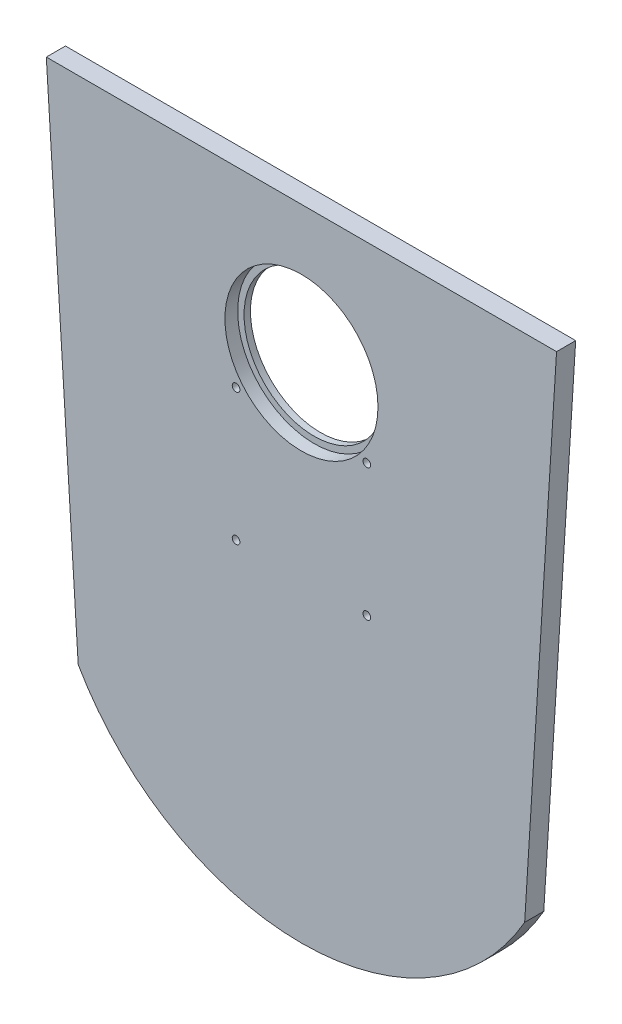
ISO-10303-21;
HEADER;
FILE_DESCRIPTION(('STEP AP214'),'2;1');
FILE_NAME('part.step','',(''),(''),'','','');
FILE_SCHEMA(('AUTOMOTIVE_DESIGN { 1 0 10303 214 1 1 1 1 }'));
ENDSEC;
DATA;
#1=APPLICATION_CONTEXT('core data for automotive mechanical design processes');
#2=APPLICATION_PROTOCOL_DEFINITION('international standard','automotive_design',2000,#1);
#3=PRODUCT_CONTEXT('',#1,'mechanical');
#4=PRODUCT('Part','Part','',(#3));
#5=PRODUCT_RELATED_PRODUCT_CATEGORY('part','',(#4));
#6=PRODUCT_DEFINITION_FORMATION('','',#4);
#7=PRODUCT_DEFINITION_CONTEXT('part definition',#1,'design');
#8=PRODUCT_DEFINITION('design','',#6,#7);
#9=PRODUCT_DEFINITION_SHAPE('','',#8);
#10=(LENGTH_UNIT() NAMED_UNIT(*) SI_UNIT(.MILLI.,.METRE.));
#11=(NAMED_UNIT(*) PLANE_ANGLE_UNIT() SI_UNIT($,.RADIAN.));
#12=(NAMED_UNIT(*) SI_UNIT($,.STERADIAN.) SOLID_ANGLE_UNIT());
#13=UNCERTAINTY_MEASURE_WITH_UNIT(LENGTH_MEASURE(1.E-05),#10,'distance_accuracy_value','');
#14=(GEOMETRIC_REPRESENTATION_CONTEXT(3) GLOBAL_UNCERTAINTY_ASSIGNED_CONTEXT((#13)) GLOBAL_UNIT_ASSIGNED_CONTEXT((#10,
#11,#12)) REPRESENTATION_CONTEXT('',''));
#15=CARTESIAN_POINT('',(0.,0.,0.));
#16=DIRECTION('',(0.,0.,1.));
#17=DIRECTION('',(1.,0.,0.));
#18=AXIS2_PLACEMENT_3D('',#15,#16,#17);
#19=CARTESIAN_POINT('',(35.,58.5,-0.00100000000000013));
#20=DIRECTION('',(0.,0.,1.));
#21=DIRECTION('',(1.,0.,0.));
#22=AXIS2_PLACEMENT_3D('',#19,#20,#21);
#23=CYLINDRICAL_SURFACE('',#22,11.);
#24=CARTESIAN_POINT('',(35.,58.5,0.));
#25=DIRECTION('',(0.,0.,-1.));
#26=DIRECTION('',(-1.,0.,0.));
#27=AXIS2_PLACEMENT_3D('',#24,#25,#26);
#28=CIRCLE('',#27,11.);
#29=CARTESIAN_POINT('',(46.,58.5,0.));
#30=VERTEX_POINT('',#29);
#31=EDGE_CURVE('E121',#30,#30,#28,.F.);
#32=CARTESIAN_POINT('',(35.,58.5,1.));
#33=DIRECTION('',(0.,0.,1.));
#34=DIRECTION('',(1.,0.,0.));
#35=AXIS2_PLACEMENT_3D('',#32,#33,#34);
#36=CIRCLE('',#35,11.);
#37=CARTESIAN_POINT('',(46.,58.5,1.));
#38=VERTEX_POINT('',#37);
#39=EDGE_CURVE('E41',#38,#38,#36,.F.);
#40=CARTESIAN_POINT('',(46.,58.5,0.));
#41=CARTESIAN_POINT('',(46.,58.5,0.0104166666666667));
#42=CARTESIAN_POINT('',(46.,58.5,0.0208333333333333));
#43=CARTESIAN_POINT('',(46.,58.5,0.0416666666666667));
#44=CARTESIAN_POINT('',(46.,58.5,0.0520833333333333));
#45=CARTESIAN_POINT('',(46.,58.5,0.0729166666666667));
#46=CARTESIAN_POINT('',(46.,58.5,0.0833333333333333));
#47=CARTESIAN_POINT('',(46.,58.5,0.104166666666667));
#48=CARTESIAN_POINT('',(46.,58.5,0.114583333333333));
#49=CARTESIAN_POINT('',(46.,58.5,0.135416666666667));
#50=CARTESIAN_POINT('',(46.,58.5,0.145833333333333));
#51=CARTESIAN_POINT('',(46.,58.5,0.166666666666667));
#52=CARTESIAN_POINT('',(46.,58.5,0.177083333333333));
#53=CARTESIAN_POINT('',(46.,58.5,0.197916666666667));
#54=CARTESIAN_POINT('',(46.,58.5,0.208333333333333));
#55=CARTESIAN_POINT('',(46.,58.5,0.229166666666667));
#56=CARTESIAN_POINT('',(46.,58.5,0.239583333333333));
#57=CARTESIAN_POINT('',(46.,58.5,0.260416666666667));
#58=CARTESIAN_POINT('',(46.,58.5,0.270833333333333));
#59=CARTESIAN_POINT('',(46.,58.5,0.291666666666667));
#60=CARTESIAN_POINT('',(46.,58.5,0.302083333333333));
#61=CARTESIAN_POINT('',(46.,58.5,0.322916666666667));
#62=CARTESIAN_POINT('',(46.,58.5,0.333333333333333));
#63=CARTESIAN_POINT('',(46.,58.5,0.354166666666667));
#64=CARTESIAN_POINT('',(46.,58.5,0.364583333333333));
#65=CARTESIAN_POINT('',(46.,58.5,0.385416666666667));
#66=CARTESIAN_POINT('',(46.,58.5,0.395833333333333));
#67=CARTESIAN_POINT('',(46.,58.5,0.416666666666667));
#68=CARTESIAN_POINT('',(46.,58.5,0.427083333333333));
#69=CARTESIAN_POINT('',(46.,58.5,0.447916666666667));
#70=CARTESIAN_POINT('',(46.,58.5,0.458333333333333));
#71=CARTESIAN_POINT('',(46.,58.5,0.479166666666667));
#72=CARTESIAN_POINT('',(46.,58.5,0.489583333333333));
#73=CARTESIAN_POINT('',(46.,58.5,0.510416666666667));
#74=CARTESIAN_POINT('',(46.,58.5,0.520833333333333));
#75=CARTESIAN_POINT('',(46.,58.5,0.541666666666667));
#76=CARTESIAN_POINT('',(46.,58.5,0.552083333333333));
#77=CARTESIAN_POINT('',(46.,58.5,0.572916666666667));
#78=CARTESIAN_POINT('',(46.,58.5,0.583333333333333));
#79=CARTESIAN_POINT('',(46.,58.5,0.604166666666667));
#80=CARTESIAN_POINT('',(46.,58.5,0.614583333333333));
#81=CARTESIAN_POINT('',(46.,58.5,0.635416666666667));
#82=CARTESIAN_POINT('',(46.,58.5,0.645833333333333));
#83=CARTESIAN_POINT('',(46.,58.5,0.666666666666667));
#84=CARTESIAN_POINT('',(46.,58.5,0.677083333333333));
#85=CARTESIAN_POINT('',(46.,58.5,0.697916666666667));
#86=CARTESIAN_POINT('',(46.,58.5,0.708333333333333));
#87=CARTESIAN_POINT('',(46.,58.5,0.729166666666667));
#88=CARTESIAN_POINT('',(46.,58.5,0.739583333333333));
#89=CARTESIAN_POINT('',(46.,58.5,0.760416666666667));
#90=CARTESIAN_POINT('',(46.,58.5,0.770833333333333));
#91=CARTESIAN_POINT('',(46.,58.5,0.791666666666667));
#92=CARTESIAN_POINT('',(46.,58.5,0.802083333333333));
#93=CARTESIAN_POINT('',(46.,58.5,0.822916666666667));
#94=CARTESIAN_POINT('',(46.,58.5,0.833333333333333));
#95=CARTESIAN_POINT('',(46.,58.5,0.854166666666667));
#96=CARTESIAN_POINT('',(46.,58.5,0.864583333333333));
#97=CARTESIAN_POINT('',(46.,58.5,0.885416666666667));
#98=CARTESIAN_POINT('',(46.,58.5,0.895833333333333));
#99=CARTESIAN_POINT('',(46.,58.5,0.916666666666667));
#100=CARTESIAN_POINT('',(46.,58.5,0.927083333333333));
#101=CARTESIAN_POINT('',(46.,58.5,0.947916666666667));
#102=CARTESIAN_POINT('',(46.,58.5,0.958333333333333));
#103=CARTESIAN_POINT('',(46.,58.5,0.979166666666667));
#104=CARTESIAN_POINT('',(46.,58.5,0.989583333333333));
#105=CARTESIAN_POINT('',(46.,58.5,1.));
#106=B_SPLINE_CURVE_WITH_KNOTS('',3,(#40,#41,#42,#43,#44,#45,#46,#47,#48,#49,#50,#51,#52,#53,
#54,#55,#56,#57,#58,#59,#60,#61,#62,#63,#64,#65,#66,#67,#68,#69,#70,#71,#72,#73,#74,#75,#76,#77,
#78,#79,#80,#81,#82,#83,#84,#85,#86,#87,#88,#89,#90,#91,#92,#93,#94,#95,#96,#97,#98,#99,#100,
#101,#102,#103,#104,#105),.UNSPECIFIED.,.F.,.F.,(4,2,2,2,2,2,2,2,2,2,2,2,2,2,2,2,2,2,2,2,2,2,2,
2,2,2,2,2,2,2,2,2,4),(0.,0.03125,0.0625,0.09375,0.125,0.15625,0.1875,0.21875,0.25,0.28125,
0.3125,0.34375,0.375,0.40625,0.4375,0.46875,0.5,0.53125,0.5625,0.59375,0.625,0.65625,0.6875,
0.71875,0.75,0.78125,0.8125,0.84375,0.875,0.90625,0.9375,0.96875,1.),.UNSPECIFIED.);
#107=EDGE_CURVE('BSEAM37',#30,#38,#106,.T.);
#108=ORIENTED_EDGE('',*,*,#31,.F.);
#109=ORIENTED_EDGE('',*,*,#39,.F.);
#110=ORIENTED_EDGE('',*,*,#107,.T.);
#111=ORIENTED_EDGE('',*,*,#107,.F.);
#112=EDGE_LOOP('',(#108,#110,#109,#111));
#113=FACE_BOUND('',#112,.T.);
#114=ADVANCED_FACE('F37',(#113),#23,.F.);
#115=CARTESIAN_POINT('',(0.,80.,3.));
#116=DIRECTION('',(0.,-1.,0.));
#117=DIRECTION('',(0.,0.,-1.));
#118=AXIS2_PLACEMENT_3D('',#115,#116,#117);
#119=PLANE('',#118);
#120=DIRECTION('',(-1.,0.,0.));
#121=VECTOR('',#120,1.);
#122=CARTESIAN_POINT('',(0.,80.,0.));
#123=LINE('',#122,#121);
#124=CARTESIAN_POINT('',(75.,80.,0.));
#125=VERTEX_POINT('',#124);
#126=CARTESIAN_POINT('',(-4.99999999999999,80.,0.));
#127=VERTEX_POINT('',#126);
#128=EDGE_CURVE('E139',#125,#127,#123,.T.);
#129=ORIENTED_EDGE('',*,*,#128,.T.);
#130=DIRECTION('',(0.,0.,-1.));
#131=VECTOR('',#130,1.);
#132=CARTESIAN_POINT('',(-4.99999999999999,80.,83.156097709407));
#133=LINE('',#132,#131);
#134=CARTESIAN_POINT('',(-4.99999999999999,80.,3.));
#135=VERTEX_POINT('',#134);
#136=EDGE_CURVE('E84',#135,#127,#133,.T.);
#137=ORIENTED_EDGE('',*,*,#136,.F.);
#138=DIRECTION('',(-1.,0.,0.));
#139=VECTOR('',#138,1.);
#140=CARTESIAN_POINT('',(0.,80.,3.));
#141=LINE('',#140,#139);
#142=CARTESIAN_POINT('',(75.,80.,3.));
#143=VERTEX_POINT('',#142);
#144=EDGE_CURVE('E142',#143,#135,#141,.T.);
#145=ORIENTED_EDGE('',*,*,#144,.F.);
#146=DIRECTION('',(0.,0.,-1.));
#147=VECTOR('',#146,1.);
#148=CARTESIAN_POINT('',(75.,80.,83.156097709407));
#149=LINE('',#148,#147);
#150=EDGE_CURVE('E104',#143,#125,#149,.T.);
#151=ORIENTED_EDGE('',*,*,#150,.T.);
#152=EDGE_LOOP('',(#129,#137,#145,#151));
#153=FACE_BOUND('',#152,.T.);
#154=ADVANCED_FACE('F39',(#153),#119,.F.);
#155=CARTESIAN_POINT('',(0.,0.,3.));
#156=DIRECTION('',(0.,0.,-1.));
#157=DIRECTION('',(-1.,0.,0.));
#158=AXIS2_PLACEMENT_3D('',#155,#156,#157);
#159=PLANE('',#158);
#160=CARTESIAN_POINT('',(35.,58.5,3.));
#161=DIRECTION('',(0.,0.,1.));
#162=DIRECTION('',(1.,0.,0.));
#163=AXIS2_PLACEMENT_3D('',#160,#161,#162);
#164=CIRCLE('',#163,12.);
#165=CARTESIAN_POINT('',(47.,58.5,3.));
#166=VERTEX_POINT('',#165);
#167=EDGE_CURVE('E108',#166,#166,#164,.T.);
#168=ORIENTED_EDGE('',*,*,#167,.F.);
#169=EDGE_LOOP('',(#168));
#170=FACE_BOUND('',#169,.T.);
#171=CARTESIAN_POINT('',(45.25,50.,3.));
#172=DIRECTION('',(0.,0.,1.));
#173=DIRECTION('',(1.,0.,0.));
#174=AXIS2_PLACEMENT_3D('',#171,#172,#173);
#175=CIRCLE('',#174,0.600000000000001);
#176=CARTESIAN_POINT('',(45.85,50.,3.));
#177=VERTEX_POINT('',#176);
#178=EDGE_CURVE('E124',#177,#177,#175,.T.);
#179=ORIENTED_EDGE('',*,*,#178,.F.);
#180=EDGE_LOOP('',(#179));
#181=FACE_BOUND('',#180,.T.);
#182=CARTESIAN_POINT('',(45.25,29.3,3.));
#183=DIRECTION('',(0.,0.,1.));
#184=DIRECTION('',(1.,0.,0.));
#185=AXIS2_PLACEMENT_3D('',#182,#183,#184);
#186=CIRCLE('',#185,0.6);
#187=CARTESIAN_POINT('',(45.85,29.3,3.));
#188=VERTEX_POINT('',#187);
#189=EDGE_CURVE('E131',#188,#188,#186,.T.);
#190=ORIENTED_EDGE('',*,*,#189,.F.);
#191=EDGE_LOOP('',(#190));
#192=FACE_BOUND('',#191,.T.);
#193=CARTESIAN_POINT('',(24.75,29.3,3.));
#194=DIRECTION('',(0.,0.,1.));
#195=DIRECTION('',(1.,0.,0.));
#196=AXIS2_PLACEMENT_3D('',#193,#194,#195);
#197=CIRCLE('',#196,0.600000000000003);
#198=CARTESIAN_POINT('',(25.35,29.3,3.));
#199=VERTEX_POINT('',#198);
#200=EDGE_CURVE('E114',#199,#199,#197,.T.);
#201=ORIENTED_EDGE('',*,*,#200,.F.);
#202=EDGE_LOOP('',(#201));
#203=FACE_BOUND('',#202,.T.);
#204=CARTESIAN_POINT('',(24.75,50.,3.));
#205=DIRECTION('',(0.,0.,1.));
#206=DIRECTION('',(1.,0.,0.));
#207=AXIS2_PLACEMENT_3D('',#204,#205,#206);
#208=CIRCLE('',#207,0.600000000000005);
#209=CARTESIAN_POINT('',(25.35,50.,3.));
#210=VERTEX_POINT('',#209);
#211=EDGE_CURVE('E136',#210,#210,#208,.T.);
#212=ORIENTED_EDGE('',*,*,#211,.F.);
#213=EDGE_LOOP('',(#212));
#214=FACE_BOUND('',#213,.T.);
#215=ORIENTED_EDGE('',*,*,#144,.T.);
#216=DIRECTION('',(0.0623782861551804,-0.998052578482889,0.));
#217=VECTOR('',#216,1.);
#218=CARTESIAN_POINT('',(0.,0.,3.));
#219=LINE('',#218,#217);
#220=CARTESIAN_POINT('',(0.,0.,3.));
#221=VERTEX_POINT('',#220);
#222=EDGE_CURVE('E60',#135,#221,#219,.T.);
#223=ORIENTED_EDGE('',*,*,#222,.T.);
#224=CARTESIAN_POINT('',(35.,20.,3.));
#225=DIRECTION('',(0.,0.,-1.));
#226=DIRECTION('',(-1.,0.,0.));
#227=AXIS2_PLACEMENT_3D('',#224,#225,#226);
#228=CIRCLE('',#227,40.3112887414928);
#229=CARTESIAN_POINT('',(70.,0.,3.));
#230=VERTEX_POINT('',#229);
#231=EDGE_CURVE('E87',#221,#230,#228,.F.);
#232=ORIENTED_EDGE('',*,*,#231,.T.);
#233=DIRECTION('',(-0.0623782861551806,-0.998052578482889,0.));
#234=VECTOR('',#233,1.);
#235=CARTESIAN_POINT('',(69.727626459144,-4.3579766536965,3.));
#236=LINE('',#235,#234);
#237=EDGE_CURVE('E53',#143,#230,#236,.T.);
#238=ORIENTED_EDGE('',*,*,#237,.F.);
#239=EDGE_LOOP('',(#215,#223,#232,#238));
#240=FACE_BOUND('',#239,.T.);
#241=ADVANCED_FACE('F147',(#170,#181,#192,#203,#214,#240),#159,.F.);
#242=CARTESIAN_POINT('',(0.,0.,0.));
#243=DIRECTION('',(0.,0.,-1.));
#244=DIRECTION('',(-1.,0.,0.));
#245=AXIS2_PLACEMENT_3D('',#242,#243,#244);
#246=PLANE('',#245);
#247=CARTESIAN_POINT('',(45.25,50.,0.));
#248=DIRECTION('',(0.,0.,-1.));
#249=DIRECTION('',(-1.,0.,0.));
#250=AXIS2_PLACEMENT_3D('',#247,#248,#249);
#251=CIRCLE('',#250,0.600000000000001);
#252=CARTESIAN_POINT('',(44.65,50.,0.));
#253=VERTEX_POINT('',#252);
#254=EDGE_CURVE('E128',#253,#253,#251,.F.);
#255=ORIENTED_EDGE('',*,*,#254,.T.);
#256=EDGE_LOOP('',(#255));
#257=FACE_BOUND('',#256,.T.);
#258=CARTESIAN_POINT('',(45.25,29.3,0.));
#259=DIRECTION('',(0.,0.,-1.));
#260=DIRECTION('',(-1.,0.,0.));
#261=AXIS2_PLACEMENT_3D('',#258,#259,#260);
#262=CIRCLE('',#261,0.6);
#263=CARTESIAN_POINT('',(44.65,29.3,0.));
#264=VERTEX_POINT('',#263);
#265=EDGE_CURVE('E117',#264,#264,#262,.F.);
#266=ORIENTED_EDGE('',*,*,#265,.T.);
#267=EDGE_LOOP('',(#266));
#268=FACE_BOUND('',#267,.T.);
#269=CARTESIAN_POINT('',(24.75,29.3,0.));
#270=DIRECTION('',(0.,0.,-1.));
#271=DIRECTION('',(-1.,0.,0.));
#272=AXIS2_PLACEMENT_3D('',#269,#270,#271);
#273=CIRCLE('',#272,0.600000000000003);
#274=CARTESIAN_POINT('',(24.15,29.3,0.));
#275=VERTEX_POINT('',#274);
#276=EDGE_CURVE('E118',#275,#275,#273,.F.);
#277=ORIENTED_EDGE('',*,*,#276,.T.);
#278=EDGE_LOOP('',(#277));
#279=FACE_BOUND('',#278,.T.);
#280=ORIENTED_EDGE('',*,*,#31,.T.);
#281=EDGE_LOOP('',(#280));
#282=FACE_BOUND('',#281,.T.);
#283=CARTESIAN_POINT('',(24.75,50.,0.));
#284=DIRECTION('',(0.,0.,-1.));
#285=DIRECTION('',(-1.,0.,0.));
#286=AXIS2_PLACEMENT_3D('',#283,#284,#285);
#287=CIRCLE('',#286,0.600000000000005);
#288=CARTESIAN_POINT('',(24.15,50.,0.));
#289=VERTEX_POINT('',#288);
#290=EDGE_CURVE('E127',#289,#289,#287,.F.);
#291=ORIENTED_EDGE('',*,*,#290,.T.);
#292=EDGE_LOOP('',(#291));
#293=FACE_BOUND('',#292,.T.);
#294=DIRECTION('',(0.0623782861551806,0.998052578482889,0.));
#295=VECTOR('',#294,1.);
#296=CARTESIAN_POINT('',(69.727626459144,-4.3579766536965,0.));
#297=LINE('',#296,#295);
#298=CARTESIAN_POINT('',(70.,0.,0.));
#299=VERTEX_POINT('',#298);
#300=EDGE_CURVE('E97',#299,#125,#297,.T.);
#301=ORIENTED_EDGE('',*,*,#300,.F.);
#302=CARTESIAN_POINT('',(35.,20.,0.));
#303=DIRECTION('',(0.,0.,-1.));
#304=DIRECTION('',(-1.,0.,0.));
#305=AXIS2_PLACEMENT_3D('',#302,#303,#304);
#306=CIRCLE('',#305,40.3112887414928);
#307=CARTESIAN_POINT('',(0.,0.,0.));
#308=VERTEX_POINT('',#307);
#309=EDGE_CURVE('E93',#299,#308,#306,.T.);
#310=ORIENTED_EDGE('',*,*,#309,.T.);
#311=DIRECTION('',(-0.0623782861551804,0.998052578482889,0.));
#312=VECTOR('',#311,1.);
#313=CARTESIAN_POINT('',(0.,0.,0.));
#314=LINE('',#313,#312);
#315=EDGE_CURVE('E80',#308,#127,#314,.T.);
#316=ORIENTED_EDGE('',*,*,#315,.T.);
#317=ORIENTED_EDGE('',*,*,#128,.F.);
#318=EDGE_LOOP('',(#301,#310,#316,#317));
#319=FACE_BOUND('',#318,.T.);
#320=ADVANCED_FACE('F95',(#257,#268,#279,#282,#293,#319),#246,.T.);
#321=CARTESIAN_POINT('',(24.75,50.,-0.00100000000000013));
#322=DIRECTION('',(0.,0.,1.));
#323=DIRECTION('',(1.,0.,0.));
#324=AXIS2_PLACEMENT_3D('',#321,#322,#323);
#325=CYLINDRICAL_SURFACE('',#324,0.600000000000005);
#326=ORIENTED_EDGE('',*,*,#290,.F.);
#327=EDGE_LOOP('',(#326));
#328=FACE_BOUND('',#327,.T.);
#329=ORIENTED_EDGE('',*,*,#211,.T.);
#330=EDGE_LOOP('',(#329));
#331=FACE_BOUND('',#330,.T.);
#332=ADVANCED_FACE('F155',(#328,#331),#325,.F.);
#333=CARTESIAN_POINT('',(24.75,29.3,-0.00100000000000013));
#334=DIRECTION('',(0.,0.,1.));
#335=DIRECTION('',(1.,0.,0.));
#336=AXIS2_PLACEMENT_3D('',#333,#334,#335);
#337=CYLINDRICAL_SURFACE('',#336,0.600000000000003);
#338=ORIENTED_EDGE('',*,*,#276,.F.);
#339=EDGE_LOOP('',(#338));
#340=FACE_BOUND('',#339,.T.);
#341=ORIENTED_EDGE('',*,*,#200,.T.);
#342=EDGE_LOOP('',(#341));
#343=FACE_BOUND('',#342,.T.);
#344=ADVANCED_FACE('F169',(#340,#343),#337,.F.);
#345=CARTESIAN_POINT('',(45.25,29.3,-0.00100000000000013));
#346=DIRECTION('',(0.,0.,1.));
#347=DIRECTION('',(1.,0.,0.));
#348=AXIS2_PLACEMENT_3D('',#345,#346,#347);
#349=CYLINDRICAL_SURFACE('',#348,0.6);
#350=ORIENTED_EDGE('',*,*,#265,.F.);
#351=EDGE_LOOP('',(#350));
#352=FACE_BOUND('',#351,.T.);
#353=ORIENTED_EDGE('',*,*,#189,.T.);
#354=EDGE_LOOP('',(#353));
#355=FACE_BOUND('',#354,.T.);
#356=ADVANCED_FACE('F175',(#352,#355),#349,.F.);
#357=CARTESIAN_POINT('',(45.25,50.,-0.00100000000000013));
#358=DIRECTION('',(0.,0.,1.));
#359=DIRECTION('',(1.,0.,0.));
#360=AXIS2_PLACEMENT_3D('',#357,#358,#359);
#361=CYLINDRICAL_SURFACE('',#360,0.600000000000001);
#362=ORIENTED_EDGE('',*,*,#254,.F.);
#363=EDGE_LOOP('',(#362));
#364=FACE_BOUND('',#363,.T.);
#365=ORIENTED_EDGE('',*,*,#178,.T.);
#366=EDGE_LOOP('',(#365));
#367=FACE_BOUND('',#366,.T.);
#368=ADVANCED_FACE('F171',(#364,#367),#361,.F.);
#369=CARTESIAN_POINT('',(35.,58.5,1.));
#370=DIRECTION('',(0.,0.,1.));
#371=DIRECTION('',(1.,0.,0.));
#372=AXIS2_PLACEMENT_3D('',#369,#370,#371);
#373=PLANE('',#372);
#374=CARTESIAN_POINT('',(35.,58.5,1.));
#375=DIRECTION('',(0.,0.,1.));
#376=DIRECTION('',(1.,0.,0.));
#377=AXIS2_PLACEMENT_3D('',#374,#375,#376);
#378=CIRCLE('',#377,12.);
#379=CARTESIAN_POINT('',(47.,58.5,1.));
#380=VERTEX_POINT('',#379);
#381=EDGE_CURVE('E109',#380,#380,#378,.T.);
#382=ORIENTED_EDGE('',*,*,#381,.T.);
#383=EDGE_LOOP('',(#382));
#384=FACE_BOUND('',#383,.T.);
#385=ORIENTED_EDGE('',*,*,#39,.T.);
#386=EDGE_LOOP('',(#385));
#387=FACE_BOUND('',#386,.T.);
#388=ADVANCED_FACE('F174',(#384,#387),#373,.T.);
#389=CARTESIAN_POINT('',(35.,58.5,1.));
#390=DIRECTION('',(0.,0.,1.));
#391=DIRECTION('',(1.,0.,0.));
#392=AXIS2_PLACEMENT_3D('',#389,#390,#391);
#393=CYLINDRICAL_SURFACE('',#392,12.);
#394=ORIENTED_EDGE('',*,*,#381,.F.);
#395=EDGE_LOOP('',(#394));
#396=FACE_BOUND('',#395,.T.);
#397=ORIENTED_EDGE('',*,*,#167,.T.);
#398=EDGE_LOOP('',(#397));
#399=FACE_BOUND('',#398,.T.);
#400=ADVANCED_FACE('F212',(#396,#399),#393,.F.);
#401=CARTESIAN_POINT('',(69.727626459144,-4.3579766536965,83.156097709407));
#402=DIRECTION('',(-0.998052578482889,0.0623782861551806,0.));
#403=DIRECTION('',(-0.0623782861551806,-0.998052578482889,0.));
#404=AXIS2_PLACEMENT_3D('',#401,#402,#403);
#405=PLANE('',#404);
#406=ORIENTED_EDGE('',*,*,#150,.F.);
#407=ORIENTED_EDGE('',*,*,#237,.T.);
#408=DIRECTION('',(0.,0.,-1.));
#409=VECTOR('',#408,1.);
#410=CARTESIAN_POINT('',(70.,0.,3.));
#411=LINE('',#410,#409);
#412=EDGE_CURVE('E46',#230,#299,#411,.T.);
#413=ORIENTED_EDGE('',*,*,#412,.T.);
#414=ORIENTED_EDGE('',*,*,#300,.T.);
#415=EDGE_LOOP('',(#406,#407,#413,#414));
#416=FACE_BOUND('',#415,.T.);
#417=ADVANCED_FACE('F145',(#416),#405,.F.);
#418=CARTESIAN_POINT('',(0.,0.,83.156097709407));
#419=DIRECTION('',(-0.998052578482889,-0.0623782861551804,0.));
#420=DIRECTION('',(0.0623782861551804,-0.998052578482889,0.));
#421=AXIS2_PLACEMENT_3D('',#418,#419,#420);
#422=PLANE('',#421);
#423=ORIENTED_EDGE('',*,*,#222,.F.);
#424=ORIENTED_EDGE('',*,*,#136,.T.);
#425=ORIENTED_EDGE('',*,*,#315,.F.);
#426=DIRECTION('',(0.,0.,-1.));
#427=VECTOR('',#426,1.);
#428=CARTESIAN_POINT('',(0.,0.,3.));
#429=LINE('',#428,#427);
#430=EDGE_CURVE('E11',#221,#308,#429,.T.);
#431=ORIENTED_EDGE('',*,*,#430,.F.);
#432=EDGE_LOOP('',(#423,#424,#425,#431));
#433=FACE_BOUND('',#432,.T.);
#434=ADVANCED_FACE('F81',(#433),#422,.T.);
#435=CARTESIAN_POINT('',(35.,20.,83.156097709407));
#436=DIRECTION('',(0.,0.,-1.));
#437=DIRECTION('',(-1.,0.,0.));
#438=AXIS2_PLACEMENT_3D('',#435,#436,#437);
#439=CYLINDRICAL_SURFACE('',#438,40.3112887414928);
#440=ORIENTED_EDGE('',*,*,#231,.F.);
#441=ORIENTED_EDGE('',*,*,#430,.T.);
#442=ORIENTED_EDGE('',*,*,#309,.F.);
#443=ORIENTED_EDGE('',*,*,#412,.F.);
#444=EDGE_LOOP('',(#440,#441,#442,#443));
#445=FACE_BOUND('',#444,.T.);
#446=ADVANCED_FACE('F91',(#445),#439,.T.);
#447=CLOSED_SHELL('',(#114,#154,#241,#320,#332,#344,#356,#368,#388,#400,#417,#434,#446));
#448=MANIFOLD_SOLID_BREP('B2',#447);
#449=ADVANCED_BREP_SHAPE_REPRESENTATION('',(#18,#448),#14);
#450=SHAPE_DEFINITION_REPRESENTATION(#9,#449);
ENDSEC;
END-ISO-10303-21;
